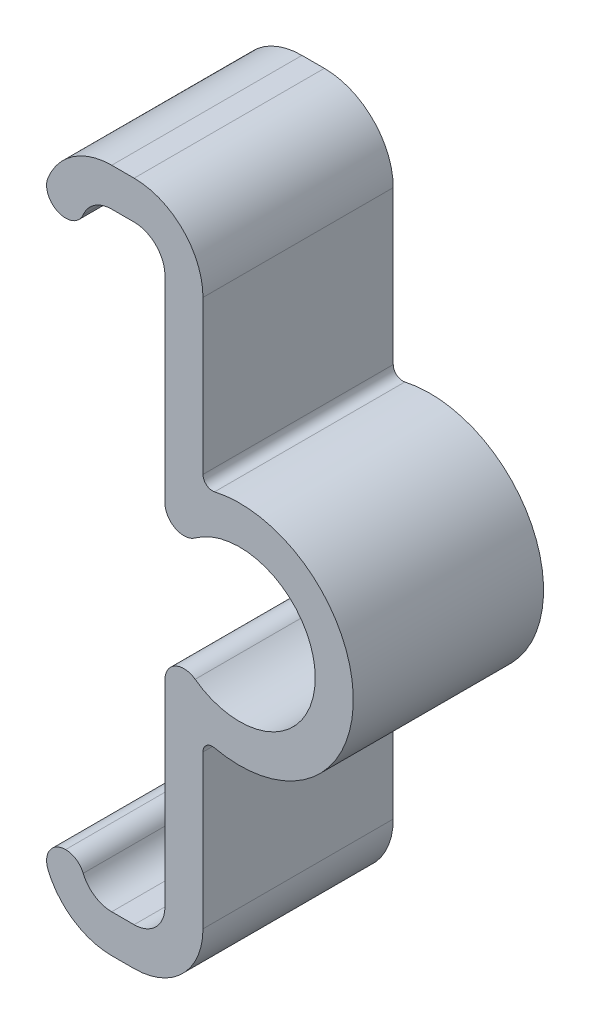
ISO-10303-21;
HEADER;
FILE_DESCRIPTION(('STEP AP214'),'2;1');
FILE_NAME('part.step','',(''),(''),'','','');
FILE_SCHEMA(('AUTOMOTIVE_DESIGN { 1 0 10303 214 1 1 1 1 }'));
ENDSEC;
DATA;
#1=APPLICATION_CONTEXT('core data for automotive mechanical design processes');
#2=APPLICATION_PROTOCOL_DEFINITION('international standard','automotive_design',2000,#1);
#3=PRODUCT_CONTEXT('',#1,'mechanical');
#4=PRODUCT('Part','Part','',(#3));
#5=PRODUCT_RELATED_PRODUCT_CATEGORY('part','',(#4));
#6=PRODUCT_DEFINITION_FORMATION('','',#4);
#7=PRODUCT_DEFINITION_CONTEXT('part definition',#1,'design');
#8=PRODUCT_DEFINITION('design','',#6,#7);
#9=PRODUCT_DEFINITION_SHAPE('','',#8);
#10=(LENGTH_UNIT() NAMED_UNIT(*) SI_UNIT(.MILLI.,.METRE.));
#11=(NAMED_UNIT(*) PLANE_ANGLE_UNIT() SI_UNIT($,.RADIAN.));
#12=(NAMED_UNIT(*) SI_UNIT($,.STERADIAN.) SOLID_ANGLE_UNIT());
#13=UNCERTAINTY_MEASURE_WITH_UNIT(LENGTH_MEASURE(1.E-05),#10,'distance_accuracy_value','');
#14=(GEOMETRIC_REPRESENTATION_CONTEXT(3) GLOBAL_UNCERTAINTY_ASSIGNED_CONTEXT((#13)) GLOBAL_UNIT_ASSIGNED_CONTEXT((#10,
#11,#12)) REPRESENTATION_CONTEXT('',''));
#15=CARTESIAN_POINT('',(0.,0.,0.));
#16=DIRECTION('',(0.,0.,1.));
#17=DIRECTION('',(1.,0.,0.));
#18=AXIS2_PLACEMENT_3D('',#15,#16,#17);
#19=CARTESIAN_POINT('',(0.,17.9899999999998,10.));
#20=DIRECTION('',(0.,-1.,0.));
#21=DIRECTION('',(1.,0.,0.));
#22=AXIS2_PLACEMENT_3D('',#19,#20,#21);
#23=PLANE('',#22);
#24=DIRECTION('',(-1.,0.,0.));
#25=VECTOR('',#24,1.);
#26=CARTESIAN_POINT('',(0.,17.9899999999998,0.));
#27=LINE('',#26,#25);
#28=CARTESIAN_POINT('',(-1.56999999999988,17.9899999999998,0.));
#29=VERTEX_POINT('',#28);
#30=CARTESIAN_POINT('',(-2.74800000000017,17.9899999999998,0.));
#31=VERTEX_POINT('',#30);
#32=EDGE_CURVE('E230',#29,#31,#27,.T.);
#33=ORIENTED_EDGE('',*,*,#32,.T.);
#34=DIRECTION('',(0.,0.,-1.));
#35=VECTOR('',#34,1.);
#36=CARTESIAN_POINT('',(-2.74800000000017,17.9899999999998,10.));
#37=LINE('',#36,#35);
#38=CARTESIAN_POINT('',(-2.74800000000017,17.9899999999998,10.));
#39=VERTEX_POINT('',#38);
#40=EDGE_CURVE('E213',#39,#31,#37,.T.);
#41=ORIENTED_EDGE('',*,*,#40,.F.);
#42=DIRECTION('',(-1.,0.,0.));
#43=VECTOR('',#42,1.);
#44=CARTESIAN_POINT('',(0.,17.9899999999998,10.));
#45=LINE('',#44,#43);
#46=CARTESIAN_POINT('',(-1.56999999999988,17.9899999999998,10.));
#47=VERTEX_POINT('',#46);
#48=EDGE_CURVE('E218',#47,#39,#45,.T.);
#49=ORIENTED_EDGE('',*,*,#48,.F.);
#50=DIRECTION('',(0.,0.,-1.));
#51=VECTOR('',#50,1.);
#52=CARTESIAN_POINT('',(-1.56999999999988,17.9899999999998,10.));
#53=LINE('',#52,#51);
#54=EDGE_CURVE('E342',#47,#29,#53,.T.);
#55=ORIENTED_EDGE('',*,*,#54,.T.);
#56=EDGE_LOOP('',(#33,#41,#49,#55));
#57=FACE_BOUND('',#56,.T.);
#58=ADVANCED_FACE('F35',(#57),#23,.F.);
#59=CARTESIAN_POINT('',(-2.74800000000055,14.37,10.));
#60=DIRECTION('',(0.,0.,-1.));
#61=DIRECTION('',(-1.,0.,0.));
#62=AXIS2_PLACEMENT_3D('',#59,#60,#61);
#63=CYLINDRICAL_SURFACE('',#62,3.61999999999977);
#64=CARTESIAN_POINT('',(-2.74800000000055,14.37,0.));
#65=DIRECTION('',(0.,0.,1.));
#66=DIRECTION('',(1.,0.,0.));
#67=AXIS2_PLACEMENT_3D('',#64,#65,#66);
#68=CIRCLE('',#67,3.61999999999977);
#69=CARTESIAN_POINT('',(-6.09394711033358,15.7516793893131,0.));
#70=VERTEX_POINT('',#69);
#71=EDGE_CURVE('E296',#31,#70,#68,.T.);
#72=ORIENTED_EDGE('',*,*,#71,.T.);
#73=DIRECTION('',(0.,0.,-1.));
#74=VECTOR('',#73,1.);
#75=CARTESIAN_POINT('',(-6.09394711033358,15.7516793893131,10.));
#76=LINE('',#75,#74);
#77=CARTESIAN_POINT('',(-6.09394711033358,15.7516793893131,10.));
#78=VERTEX_POINT('',#77);
#79=EDGE_CURVE('E216',#70,#78,#76,.F.);
#80=ORIENTED_EDGE('',*,*,#79,.T.);
#81=CARTESIAN_POINT('',(-2.74800000000055,14.37,10.));
#82=DIRECTION('',(0.,0.,1.));
#83=DIRECTION('',(1.,0.,0.));
#84=AXIS2_PLACEMENT_3D('',#81,#82,#83);
#85=CIRCLE('',#84,3.61999999999977);
#86=EDGE_CURVE('E208',#39,#78,#85,.T.);
#87=ORIENTED_EDGE('',*,*,#86,.F.);
#88=ORIENTED_EDGE('',*,*,#40,.T.);
#89=EDGE_LOOP('',(#72,#80,#87,#88));
#90=FACE_BOUND('',#89,.T.);
#91=ADVANCED_FACE('F211',(#90),#63,.T.);
#92=CARTESIAN_POINT('',(-2.74800000000056,14.37,10.));
#93=DIRECTION('',(0.,0.,-1.));
#94=DIRECTION('',(-1.,0.,0.));
#95=AXIS2_PLACEMENT_3D('',#92,#93,#94);
#96=CYLINDRICAL_SURFACE('',#95,1.61999999999978);
#97=CARTESIAN_POINT('',(-2.74800000000056,14.37,10.));
#98=DIRECTION('',(0.,0.,1.));
#99=DIRECTION('',(1.,0.,0.));
#100=AXIS2_PLACEMENT_3D('',#97,#98,#99);
#101=CIRCLE('',#100,1.61999999999978);
#102=CARTESIAN_POINT('',(-2.74800000000017,15.9899999999998,10.));
#103=VERTEX_POINT('',#102);
#104=CARTESIAN_POINT('',(-4.24535754661357,14.988320610687,10.));
#105=VERTEX_POINT('',#104);
#106=EDGE_CURVE('E217',#103,#105,#101,.T.);
#107=ORIENTED_EDGE('',*,*,#106,.T.);
#108=DIRECTION('',(0.,0.,-1.));
#109=VECTOR('',#108,1.);
#110=CARTESIAN_POINT('',(-4.24535754661357,14.988320610687,10.));
#111=LINE('',#110,#109);
#112=CARTESIAN_POINT('',(-4.24535754661357,14.988320610687,0.));
#113=VERTEX_POINT('',#112);
#114=EDGE_CURVE('E288',#105,#113,#111,.T.);
#115=ORIENTED_EDGE('',*,*,#114,.T.);
#116=CARTESIAN_POINT('',(-2.74800000000056,14.37,0.));
#117=DIRECTION('',(0.,0.,1.));
#118=DIRECTION('',(1.,0.,0.));
#119=AXIS2_PLACEMENT_3D('',#116,#117,#118);
#120=CIRCLE('',#119,1.61999999999978);
#121=CARTESIAN_POINT('',(-2.74800000000017,15.9899999999998,0.));
#122=VERTEX_POINT('',#121);
#123=EDGE_CURVE('E381',#122,#113,#120,.T.);
#124=ORIENTED_EDGE('',*,*,#123,.F.);
#125=DIRECTION('',(0.,0.,-1.));
#126=VECTOR('',#125,1.);
#127=CARTESIAN_POINT('',(-2.74800000000017,15.9899999999998,10.));
#128=LINE('',#127,#126);
#129=EDGE_CURVE('E232',#103,#122,#128,.T.);
#130=ORIENTED_EDGE('',*,*,#129,.F.);
#131=EDGE_LOOP('',(#107,#115,#124,#130));
#132=FACE_BOUND('',#131,.T.);
#133=ADVANCED_FACE('F518',(#132),#96,.F.);
#134=CARTESIAN_POINT('',(-6.59312728916929E-13,15.9899999999999,10.));
#135=DIRECTION('',(0.,-1.,0.));
#136=DIRECTION('',(1.,0.,0.));
#137=AXIS2_PLACEMENT_3D('',#134,#135,#136);
#138=PLANE('',#137);
#139=DIRECTION('',(-1.,0.,0.));
#140=VECTOR('',#139,1.);
#141=CARTESIAN_POINT('',(-6.59312728916929E-13,15.9899999999999,0.));
#142=LINE('',#141,#140);
#143=CARTESIAN_POINT('',(-1.56999999999988,15.9899999999999,0.));
#144=VERTEX_POINT('',#143);
#145=EDGE_CURVE('E377',#144,#122,#142,.T.);
#146=ORIENTED_EDGE('',*,*,#145,.F.);
#147=DIRECTION('',(0.,0.,-1.));
#148=VECTOR('',#147,1.);
#149=CARTESIAN_POINT('',(-1.56999999999988,15.9899999999999,10.));
#150=LINE('',#149,#148);
#151=CARTESIAN_POINT('',(-1.56999999999988,15.9899999999999,10.));
#152=VERTEX_POINT('',#151);
#153=EDGE_CURVE('E237',#152,#144,#150,.T.);
#154=ORIENTED_EDGE('',*,*,#153,.F.);
#155=DIRECTION('',(-1.,0.,0.));
#156=VECTOR('',#155,1.);
#157=CARTESIAN_POINT('',(-6.59312728916929E-13,15.9899999999999,10.));
#158=LINE('',#157,#156);
#159=EDGE_CURVE('E427',#152,#103,#158,.T.);
#160=ORIENTED_EDGE('',*,*,#159,.T.);
#161=ORIENTED_EDGE('',*,*,#129,.T.);
#162=EDGE_LOOP('',(#146,#154,#160,#161));
#163=FACE_BOUND('',#162,.T.);
#164=ADVANCED_FACE('F378',(#163),#138,.T.);
#165=CARTESIAN_POINT('',(-1.56999999999988,14.37,10.));
#166=DIRECTION('',(0.,0.,-1.));
#167=DIRECTION('',(-1.,0.,0.));
#168=AXIS2_PLACEMENT_3D('',#165,#166,#167);
#169=CYLINDRICAL_SURFACE('',#168,1.61999999999985);
#170=CARTESIAN_POINT('',(-1.56999999999988,14.37,0.));
#171=DIRECTION('',(0.,0.,1.));
#172=DIRECTION('',(1.,0.,0.));
#173=AXIS2_PLACEMENT_3D('',#170,#171,#172);
#174=CIRCLE('',#173,1.61999999999985);
#175=CARTESIAN_POINT('',(0.05,14.3700000000001,0.));
#176=VERTEX_POINT('',#175);
#177=EDGE_CURVE('E370',#176,#144,#174,.T.);
#178=ORIENTED_EDGE('',*,*,#177,.F.);
#179=DIRECTION('',(0.,0.,-1.));
#180=VECTOR('',#179,1.);
#181=CARTESIAN_POINT('',(0.05,14.3700000000001,10.));
#182=LINE('',#181,#180);
#183=CARTESIAN_POINT('',(0.05,14.3700000000001,10.));
#184=VERTEX_POINT('',#183);
#185=EDGE_CURVE('E361',#184,#176,#182,.T.);
#186=ORIENTED_EDGE('',*,*,#185,.F.);
#187=CARTESIAN_POINT('',(-1.56999999999988,14.37,10.));
#188=DIRECTION('',(0.,0.,1.));
#189=DIRECTION('',(1.,0.,0.));
#190=AXIS2_PLACEMENT_3D('',#187,#188,#189);
#191=CIRCLE('',#190,1.61999999999985);
#192=EDGE_CURVE('E372',#184,#152,#191,.T.);
#193=ORIENTED_EDGE('',*,*,#192,.T.);
#194=ORIENTED_EDGE('',*,*,#153,.T.);
#195=EDGE_LOOP('',(#178,#186,#193,#194));
#196=FACE_BOUND('',#195,.T.);
#197=ADVANCED_FACE('F367',(#196),#169,.F.);
#198=CARTESIAN_POINT('',(0.0499999999999965,0.,10.));
#199=DIRECTION('',(-1.,0.,0.));
#200=DIRECTION('',(0.,-1.,0.));
#201=AXIS2_PLACEMENT_3D('',#198,#199,#200);
#202=PLANE('',#201);
#203=DIRECTION('',(0.,1.,0.));
#204=VECTOR('',#203,1.);
#205=CARTESIAN_POINT('',(0.0499999999999965,0.,0.));
#206=LINE('',#205,#204);
#207=CARTESIAN_POINT('',(0.0499999999999975,4.02430118157177,0.));
#208=VERTEX_POINT('',#207);
#209=EDGE_CURVE('E384',#208,#176,#206,.T.);
#210=ORIENTED_EDGE('',*,*,#209,.F.);
#211=DIRECTION('',(0.,0.,-1.));
#212=VECTOR('',#211,1.);
#213=CARTESIAN_POINT('',(0.0499999999999975,4.02430118157177,10.));
#214=LINE('',#213,#212);
#215=CARTESIAN_POINT('',(0.0499999999999975,4.02430118157177,10.));
#216=VERTEX_POINT('',#215);
#217=EDGE_CURVE('E253',#208,#216,#214,.F.);
#218=ORIENTED_EDGE('',*,*,#217,.T.);
#219=DIRECTION('',(0.,1.,0.));
#220=VECTOR('',#219,1.);
#221=CARTESIAN_POINT('',(0.0499999999999965,0.,10.));
#222=LINE('',#221,#220);
#223=EDGE_CURVE('E426',#216,#184,#222,.T.);
#224=ORIENTED_EDGE('',*,*,#223,.T.);
#225=ORIENTED_EDGE('',*,*,#185,.T.);
#226=EDGE_LOOP('',(#210,#218,#224,#225));
#227=FACE_BOUND('',#226,.T.);
#228=ADVANCED_FACE('F424',(#227),#202,.T.);
#229=CARTESIAN_POINT('',(3.975,0.,10.));
#230=DIRECTION('',(0.,0.,-1.));
#231=DIRECTION('',(-1.,0.,0.));
#232=AXIS2_PLACEMENT_3D('',#229,#230,#231);
#233=CYLINDRICAL_SURFACE('',#232,3.975);
#234=CARTESIAN_POINT('',(3.975,0.,0.));
#235=DIRECTION('',(0.,0.,1.));
#236=DIRECTION('',(1.,0.,0.));
#237=AXIS2_PLACEMENT_3D('',#234,#235,#236);
#238=CIRCLE('',#237,3.975);
#239=CARTESIAN_POINT('',(1.63793969849246,-3.21539642145684,0.));
#240=VERTEX_POINT('',#239);
#241=CARTESIAN_POINT('',(1.63793969849246,3.21539642145685,0.));
#242=VERTEX_POINT('',#241);
#243=EDGE_CURVE('E386',#240,#242,#238,.T.);
#244=ORIENTED_EDGE('',*,*,#243,.F.);
#245=DIRECTION('',(0.,0.,-1.));
#246=VECTOR('',#245,1.);
#247=CARTESIAN_POINT('',(1.63793969849246,-3.21539642145684,10.));
#248=LINE('',#247,#246);
#249=CARTESIAN_POINT('',(1.63793969849246,-3.21539642145684,10.));
#250=VERTEX_POINT('',#249);
#251=EDGE_CURVE('E247',#240,#250,#248,.F.);
#252=ORIENTED_EDGE('',*,*,#251,.T.);
#253=CARTESIAN_POINT('',(3.975,0.,10.));
#254=DIRECTION('',(0.,0.,1.));
#255=DIRECTION('',(1.,0.,0.));
#256=AXIS2_PLACEMENT_3D('',#253,#254,#255);
#257=CIRCLE('',#256,3.975);
#258=CARTESIAN_POINT('',(1.63793969849246,3.21539642145685,10.));
#259=VERTEX_POINT('',#258);
#260=EDGE_CURVE('E418',#250,#259,#257,.T.);
#261=ORIENTED_EDGE('',*,*,#260,.T.);
#262=DIRECTION('',(0.,0.,-1.));
#263=VECTOR('',#262,1.);
#264=CARTESIAN_POINT('',(1.63793969849246,3.21539642145685,10.));
#265=LINE('',#264,#263);
#266=EDGE_CURVE('E244',#259,#242,#265,.T.);
#267=ORIENTED_EDGE('',*,*,#266,.T.);
#268=EDGE_LOOP('',(#244,#252,#261,#267));
#269=FACE_BOUND('',#268,.T.);
#270=ADVANCED_FACE('F414',(#269),#233,.F.);
#271=CARTESIAN_POINT('',(0.0499999999999965,0.,10.));
#272=DIRECTION('',(-1.,0.,0.));
#273=DIRECTION('',(0.,-1.,0.));
#274=AXIS2_PLACEMENT_3D('',#271,#272,#273);
#275=PLANE('',#274);
#276=DIRECTION('',(0.,1.,0.));
#277=VECTOR('',#276,1.);
#278=CARTESIAN_POINT('',(0.0499999999999965,0.,10.));
#279=LINE('',#278,#277);
#280=CARTESIAN_POINT('',(0.049999999999993,-14.3700000000001,10.));
#281=VERTEX_POINT('',#280);
#282=CARTESIAN_POINT('',(0.0499999999999955,-4.02430118157177,10.));
#283=VERTEX_POINT('',#282);
#284=EDGE_CURVE('E407',#281,#283,#279,.T.);
#285=ORIENTED_EDGE('',*,*,#284,.T.);
#286=DIRECTION('',(0.,0.,-1.));
#287=VECTOR('',#286,1.);
#288=CARTESIAN_POINT('',(0.0499999999999955,-4.02430118157177,10.));
#289=LINE('',#288,#287);
#290=CARTESIAN_POINT('',(0.0499999999999955,-4.02430118157177,0.));
#291=VERTEX_POINT('',#290);
#292=EDGE_CURVE('E231',#283,#291,#289,.T.);
#293=ORIENTED_EDGE('',*,*,#292,.T.);
#294=DIRECTION('',(0.,1.,0.));
#295=VECTOR('',#294,1.);
#296=CARTESIAN_POINT('',(0.0499999999999965,0.,0.));
#297=LINE('',#296,#295);
#298=CARTESIAN_POINT('',(0.049999999999993,-14.3700000000001,0.));
#299=VERTEX_POINT('',#298);
#300=EDGE_CURVE('E392',#299,#291,#297,.T.);
#301=ORIENTED_EDGE('',*,*,#300,.F.);
#302=DIRECTION('',(0.,0.,-1.));
#303=VECTOR('',#302,1.);
#304=CARTESIAN_POINT('',(0.049999999999993,-14.3700000000001,10.));
#305=LINE('',#304,#303);
#306=EDGE_CURVE('E359',#281,#299,#305,.T.);
#307=ORIENTED_EDGE('',*,*,#306,.F.);
#308=EDGE_LOOP('',(#285,#293,#301,#307));
#309=FACE_BOUND('',#308,.T.);
#310=ADVANCED_FACE('F405',(#309),#275,.T.);
#311=CARTESIAN_POINT('',(-1.57000000000018,-14.3700000000001,10.));
#312=DIRECTION('',(0.,0.,-1.));
#313=DIRECTION('',(-1.,0.,0.));
#314=AXIS2_PLACEMENT_3D('',#311,#312,#313);
#315=CYLINDRICAL_SURFACE('',#314,1.62000000000017);
#316=CARTESIAN_POINT('',(-1.57000000000018,-14.3700000000001,0.));
#317=DIRECTION('',(0.,0.,1.));
#318=DIRECTION('',(1.,0.,0.));
#319=AXIS2_PLACEMENT_3D('',#316,#317,#318);
#320=CIRCLE('',#319,1.62000000000017);
#321=CARTESIAN_POINT('',(-1.57000000000015,-15.9900000000003,0.));
#322=VERTEX_POINT('',#321);
#323=EDGE_CURVE('E326',#322,#299,#320,.T.);
#324=ORIENTED_EDGE('',*,*,#323,.F.);
#325=DIRECTION('',(0.,0.,-1.));
#326=VECTOR('',#325,1.);
#327=CARTESIAN_POINT('',(-1.57000000000015,-15.9900000000003,10.));
#328=LINE('',#327,#326);
#329=CARTESIAN_POINT('',(-1.57000000000015,-15.9900000000003,10.));
#330=VERTEX_POINT('',#329);
#331=EDGE_CURVE('E357',#330,#322,#328,.T.);
#332=ORIENTED_EDGE('',*,*,#331,.F.);
#333=CARTESIAN_POINT('',(-1.57000000000018,-14.3700000000001,10.));
#334=DIRECTION('',(0.,0.,1.));
#335=DIRECTION('',(1.,0.,0.));
#336=AXIS2_PLACEMENT_3D('',#333,#334,#335);
#337=CIRCLE('',#336,1.62000000000017);
#338=EDGE_CURVE('E401',#330,#281,#337,.T.);
#339=ORIENTED_EDGE('',*,*,#338,.T.);
#340=ORIENTED_EDGE('',*,*,#306,.T.);
#341=EDGE_LOOP('',(#324,#332,#339,#340));
#342=FACE_BOUND('',#341,.T.);
#343=ADVANCED_FACE('F398',(#342),#315,.F.);
#344=CARTESIAN_POINT('',(0.,-15.9900000000003,10.));
#345=DIRECTION('',(0.,1.,0.));
#346=DIRECTION('',(0.,0.,1.));
#347=AXIS2_PLACEMENT_3D('',#344,#345,#346);
#348=PLANE('',#347);
#349=DIRECTION('',(1.,0.,0.));
#350=VECTOR('',#349,1.);
#351=CARTESIAN_POINT('',(0.,-15.9900000000003,0.));
#352=LINE('',#351,#350);
#353=CARTESIAN_POINT('',(-2.74799999999983,-15.9900000000003,0.));
#354=VERTEX_POINT('',#353);
#355=EDGE_CURVE('E322',#354,#322,#352,.T.);
#356=ORIENTED_EDGE('',*,*,#355,.F.);
#357=DIRECTION('',(0.,0.,-1.));
#358=VECTOR('',#357,1.);
#359=CARTESIAN_POINT('',(-2.74799999999983,-15.9900000000003,10.));
#360=LINE('',#359,#358);
#361=CARTESIAN_POINT('',(-2.74799999999983,-15.9900000000003,10.));
#362=VERTEX_POINT('',#361);
#363=EDGE_CURVE('E319',#362,#354,#360,.T.);
#364=ORIENTED_EDGE('',*,*,#363,.F.);
#365=DIRECTION('',(1.,0.,0.));
#366=VECTOR('',#365,1.);
#367=CARTESIAN_POINT('',(0.,-15.9900000000003,10.));
#368=LINE('',#367,#366);
#369=EDGE_CURVE('E436',#362,#330,#368,.T.);
#370=ORIENTED_EDGE('',*,*,#369,.T.);
#371=ORIENTED_EDGE('',*,*,#331,.T.);
#372=EDGE_LOOP('',(#356,#364,#370,#371));
#373=FACE_BOUND('',#372,.T.);
#374=ADVANCED_FACE('F504',(#373),#348,.T.);
#375=CARTESIAN_POINT('',(-2.74799999999983,-14.3700000000001,10.));
#376=DIRECTION('',(0.,0.,-1.));
#377=DIRECTION('',(-1.,0.,0.));
#378=AXIS2_PLACEMENT_3D('',#375,#376,#377);
#379=CYLINDRICAL_SURFACE('',#378,1.62000000000016);
#380=CARTESIAN_POINT('',(-2.74799999999983,-14.3700000000001,0.));
#381=DIRECTION('',(0.,0.,1.));
#382=DIRECTION('',(1.,0.,0.));
#383=AXIS2_PLACEMENT_3D('',#380,#381,#382);
#384=CIRCLE('',#383,1.62000000000016);
#385=CARTESIAN_POINT('',(-4.24535754661323,-14.9883206106872,0.));
#386=VERTEX_POINT('',#385);
#387=EDGE_CURVE('E312',#386,#354,#384,.T.);
#388=ORIENTED_EDGE('',*,*,#387,.F.);
#389=DIRECTION('',(0.,0.,-1.));
#390=VECTOR('',#389,1.);
#391=CARTESIAN_POINT('',(-4.24535754661323,-14.9883206106872,10.));
#392=LINE('',#391,#390);
#393=CARTESIAN_POINT('',(-4.24535754661323,-14.9883206106872,10.));
#394=VERTEX_POINT('',#393);
#395=EDGE_CURVE('E11',#386,#394,#392,.F.);
#396=ORIENTED_EDGE('',*,*,#395,.T.);
#397=CARTESIAN_POINT('',(-2.74799999999983,-14.3700000000001,10.));
#398=DIRECTION('',(0.,0.,1.));
#399=DIRECTION('',(1.,0.,0.));
#400=AXIS2_PLACEMENT_3D('',#397,#398,#399);
#401=CIRCLE('',#400,1.62000000000016);
#402=EDGE_CURVE('E439',#394,#362,#401,.T.);
#403=ORIENTED_EDGE('',*,*,#402,.T.);
#404=ORIENTED_EDGE('',*,*,#363,.T.);
#405=EDGE_LOOP('',(#388,#396,#403,#404));
#406=FACE_BOUND('',#405,.T.);
#407=ADVANCED_FACE('F316',(#406),#379,.F.);
#408=CARTESIAN_POINT('',(-2.74799999999983,-14.3700000000001,10.));
#409=DIRECTION('',(0.,0.,-1.));
#410=DIRECTION('',(-1.,0.,0.));
#411=AXIS2_PLACEMENT_3D('',#408,#409,#410);
#412=CYLINDRICAL_SURFACE('',#411,3.62000000000015);
#413=CARTESIAN_POINT('',(-2.74799999999983,-14.3700000000001,10.));
#414=DIRECTION('',(0.,0.,1.));
#415=DIRECTION('',(1.,0.,0.));
#416=AXIS2_PLACEMENT_3D('',#413,#414,#415);
#417=CIRCLE('',#416,3.62000000000015);
#418=CARTESIAN_POINT('',(-6.0939471103333,-15.7516793893131,10.));
#419=VERTEX_POINT('',#418);
#420=CARTESIAN_POINT('',(-2.74799999999983,-17.9900000000003,10.));
#421=VERTEX_POINT('',#420);
#422=EDGE_CURVE('E441',#419,#421,#417,.T.);
#423=ORIENTED_EDGE('',*,*,#422,.F.);
#424=DIRECTION('',(0.,0.,-1.));
#425=VECTOR('',#424,1.);
#426=CARTESIAN_POINT('',(-6.0939471103333,-15.7516793893131,10.));
#427=LINE('',#426,#425);
#428=CARTESIAN_POINT('',(-6.0939471103333,-15.7516793893131,0.));
#429=VERTEX_POINT('',#428);
#430=EDGE_CURVE('E44',#419,#429,#427,.T.);
#431=ORIENTED_EDGE('',*,*,#430,.T.);
#432=CARTESIAN_POINT('',(-2.74799999999983,-14.3700000000001,0.));
#433=DIRECTION('',(0.,0.,1.));
#434=DIRECTION('',(1.,0.,0.));
#435=AXIS2_PLACEMENT_3D('',#432,#433,#434);
#436=CIRCLE('',#435,3.62000000000015);
#437=CARTESIAN_POINT('',(-2.74799999999983,-17.9900000000003,0.));
#438=VERTEX_POINT('',#437);
#439=EDGE_CURVE('E321',#429,#438,#436,.T.);
#440=ORIENTED_EDGE('',*,*,#439,.T.);
#441=DIRECTION('',(0.,0.,-1.));
#442=VECTOR('',#441,1.);
#443=CARTESIAN_POINT('',(-2.74799999999983,-17.9900000000003,10.));
#444=LINE('',#443,#442);
#445=EDGE_CURVE('E353',#421,#438,#444,.T.);
#446=ORIENTED_EDGE('',*,*,#445,.F.);
#447=EDGE_LOOP('',(#423,#431,#440,#446));
#448=FACE_BOUND('',#447,.T.);
#449=ADVANCED_FACE('F501',(#448),#412,.T.);
#450=CARTESIAN_POINT('',(0.,-17.9900000000003,10.));
#451=DIRECTION('',(0.,1.,0.));
#452=DIRECTION('',(0.,0.,1.));
#453=AXIS2_PLACEMENT_3D('',#450,#451,#452);
#454=PLANE('',#453);
#455=DIRECTION('',(1.,0.,0.));
#456=VECTOR('',#455,1.);
#457=CARTESIAN_POINT('',(0.,-17.9900000000003,0.));
#458=LINE('',#457,#456);
#459=CARTESIAN_POINT('',(-1.57000000000015,-17.9900000000003,0.));
#460=VERTEX_POINT('',#459);
#461=EDGE_CURVE('E324',#438,#460,#458,.T.);
#462=ORIENTED_EDGE('',*,*,#461,.T.);
#463=DIRECTION('',(0.,0.,-1.));
#464=VECTOR('',#463,1.);
#465=CARTESIAN_POINT('',(-1.57000000000015,-17.9900000000003,10.));
#466=LINE('',#465,#464);
#467=CARTESIAN_POINT('',(-1.57000000000015,-17.9900000000003,10.));
#468=VERTEX_POINT('',#467);
#469=EDGE_CURVE('E350',#468,#460,#466,.T.);
#470=ORIENTED_EDGE('',*,*,#469,.F.);
#471=DIRECTION('',(1.,0.,0.));
#472=VECTOR('',#471,1.);
#473=CARTESIAN_POINT('',(0.,-17.9900000000003,10.));
#474=LINE('',#473,#472);
#475=EDGE_CURVE('E443',#421,#468,#474,.T.);
#476=ORIENTED_EDGE('',*,*,#475,.F.);
#477=ORIENTED_EDGE('',*,*,#445,.T.);
#478=EDGE_LOOP('',(#462,#470,#476,#477));
#479=FACE_BOUND('',#478,.T.);
#480=ADVANCED_FACE('F496',(#479),#454,.F.);
#481=CARTESIAN_POINT('',(-1.57000000000018,-14.3700000000001,10.));
#482=DIRECTION('',(0.,0.,-1.));
#483=DIRECTION('',(-1.,0.,0.));
#484=AXIS2_PLACEMENT_3D('',#481,#482,#483);
#485=CYLINDRICAL_SURFACE('',#484,3.62000000000017);
#486=CARTESIAN_POINT('',(-1.57000000000018,-14.3700000000001,0.));
#487=DIRECTION('',(0.,0.,1.));
#488=DIRECTION('',(1.,0.,0.));
#489=AXIS2_PLACEMENT_3D('',#486,#487,#488);
#490=CIRCLE('',#489,3.62000000000017);
#491=CARTESIAN_POINT('',(2.04999999999999,-14.3700000000001,0.));
#492=VERTEX_POINT('',#491);
#493=EDGE_CURVE('E331',#460,#492,#490,.T.);
#494=ORIENTED_EDGE('',*,*,#493,.T.);
#495=DIRECTION('',(0.,0.,-1.));
#496=VECTOR('',#495,1.);
#497=CARTESIAN_POINT('',(2.04999999999999,-14.3700000000001,10.));
#498=LINE('',#497,#496);
#499=CARTESIAN_POINT('',(2.04999999999999,-14.3700000000001,10.));
#500=VERTEX_POINT('',#499);
#501=EDGE_CURVE('E347',#500,#492,#498,.T.);
#502=ORIENTED_EDGE('',*,*,#501,.F.);
#503=CARTESIAN_POINT('',(-1.57000000000018,-14.3700000000001,10.));
#504=DIRECTION('',(0.,0.,1.));
#505=DIRECTION('',(1.,0.,0.));
#506=AXIS2_PLACEMENT_3D('',#503,#504,#505);
#507=CIRCLE('',#506,3.62000000000017);
#508=EDGE_CURVE('E445',#468,#500,#507,.T.);
#509=ORIENTED_EDGE('',*,*,#508,.F.);
#510=ORIENTED_EDGE('',*,*,#469,.T.);
#511=EDGE_LOOP('',(#494,#502,#509,#510));
#512=FACE_BOUND('',#511,.T.);
#513=ADVANCED_FACE('F492',(#512),#485,.T.);
#514=CARTESIAN_POINT('',(2.04999999999997,0.,10.));
#515=DIRECTION('',(-1.,0.,0.));
#516=DIRECTION('',(0.,-1.,0.));
#517=AXIS2_PLACEMENT_3D('',#514,#515,#516);
#518=PLANE('',#517);
#519=DIRECTION('',(0.,1.,0.));
#520=VECTOR('',#519,1.);
#521=CARTESIAN_POINT('',(2.04999999999997,0.,0.));
#522=LINE('',#521,#520);
#523=CARTESIAN_POINT('',(2.04999999999998,-6.31624888679982,0.));
#524=VERTEX_POINT('',#523);
#525=EDGE_CURVE('E333',#492,#524,#522,.T.);
#526=ORIENTED_EDGE('',*,*,#525,.T.);
#527=DIRECTION('',(0.,0.,1.));
#528=VECTOR('',#527,1.);
#529=CARTESIAN_POINT('',(2.04999999999998,-6.31624888679982,10.));
#530=LINE('',#529,#528);
#531=CARTESIAN_POINT('',(2.04999999999998,-6.31624888679982,10.));
#532=VERTEX_POINT('',#531);
#533=EDGE_CURVE('E260',#524,#532,#530,.T.);
#534=ORIENTED_EDGE('',*,*,#533,.T.);
#535=DIRECTION('',(0.,1.,0.));
#536=VECTOR('',#535,1.);
#537=CARTESIAN_POINT('',(2.04999999999997,0.,10.));
#538=LINE('',#537,#536);
#539=EDGE_CURVE('E447',#500,#532,#538,.T.);
#540=ORIENTED_EDGE('',*,*,#539,.F.);
#541=ORIENTED_EDGE('',*,*,#501,.T.);
#542=EDGE_LOOP('',(#526,#534,#540,#541));
#543=FACE_BOUND('',#542,.T.);
#544=ADVANCED_FACE('F487',(#543),#518,.F.);
#545=CARTESIAN_POINT('',(3.975,0.,10.));
#546=DIRECTION('',(0.,0.,-1.));
#547=DIRECTION('',(-1.,0.,0.));
#548=AXIS2_PLACEMENT_3D('',#545,#546,#547);
#549=CYLINDRICAL_SURFACE('',#548,5.975);
#550=CARTESIAN_POINT('',(3.975,0.,10.));
#551=DIRECTION('',(0.,0.,1.));
#552=DIRECTION('',(1.,0.,0.));
#553=AXIS2_PLACEMENT_3D('',#550,#551,#552);
#554=CIRCLE('',#553,5.975);
#555=CARTESIAN_POINT('',(2.66003861003859,-5.82850766001991,10.));
#556=VERTEX_POINT('',#555);
#557=CARTESIAN_POINT('',(2.66003861003858,5.82850766001991,10.));
#558=VERTEX_POINT('',#557);
#559=EDGE_CURVE('E450',#556,#558,#554,.T.);
#560=ORIENTED_EDGE('',*,*,#559,.F.);
#561=DIRECTION('',(0.,0.,-1.));
#562=VECTOR('',#561,1.);
#563=CARTESIAN_POINT('',(2.66003861003859,-5.82850766001991,10.));
#564=LINE('',#563,#562);
#565=CARTESIAN_POINT('',(2.66003861003859,-5.82850766001991,0.));
#566=VERTEX_POINT('',#565);
#567=EDGE_CURVE('E257',#556,#566,#564,.T.);
#568=ORIENTED_EDGE('',*,*,#567,.T.);
#569=CARTESIAN_POINT('',(3.975,0.,0.));
#570=DIRECTION('',(0.,0.,1.));
#571=DIRECTION('',(1.,0.,0.));
#572=AXIS2_PLACEMENT_3D('',#569,#570,#571);
#573=CIRCLE('',#572,5.975);
#574=CARTESIAN_POINT('',(2.66003861003858,5.82850766001991,0.));
#575=VERTEX_POINT('',#574);
#576=EDGE_CURVE('E336',#566,#575,#573,.T.);
#577=ORIENTED_EDGE('',*,*,#576,.T.);
#578=DIRECTION('',(0.,0.,-1.));
#579=VECTOR('',#578,1.);
#580=CARTESIAN_POINT('',(2.66003861003858,5.82850766001991,10.));
#581=LINE('',#580,#579);
#582=EDGE_CURVE('E255',#575,#558,#581,.F.);
#583=ORIENTED_EDGE('',*,*,#582,.T.);
#584=EDGE_LOOP('',(#560,#568,#577,#583));
#585=FACE_BOUND('',#584,.T.);
#586=ADVANCED_FACE('F478',(#585),#549,.T.);
#587=CARTESIAN_POINT('',(2.04999999999997,0.,10.));
#588=DIRECTION('',(-1.,0.,0.));
#589=DIRECTION('',(0.,-1.,0.));
#590=AXIS2_PLACEMENT_3D('',#587,#588,#589);
#591=PLANE('',#590);
#592=DIRECTION('',(0.,1.,0.));
#593=VECTOR('',#592,1.);
#594=CARTESIAN_POINT('',(2.04999999999997,0.,10.));
#595=LINE('',#594,#593);
#596=CARTESIAN_POINT('',(2.04999999999996,6.31624888679981,10.));
#597=VERTEX_POINT('',#596);
#598=CARTESIAN_POINT('',(2.04999999999995,14.3700000000001,10.));
#599=VERTEX_POINT('',#598);
#600=EDGE_CURVE('E453',#597,#599,#595,.T.);
#601=ORIENTED_EDGE('',*,*,#600,.F.);
#602=DIRECTION('',(0.,0.,1.));
#603=VECTOR('',#602,1.);
#604=CARTESIAN_POINT('',(2.04999999999996,6.31624888679981,0.));
#605=LINE('',#604,#603);
#606=CARTESIAN_POINT('',(2.04999999999996,6.31624888679981,0.));
#607=VERTEX_POINT('',#606);
#608=EDGE_CURVE('E262',#597,#607,#605,.F.);
#609=ORIENTED_EDGE('',*,*,#608,.T.);
#610=DIRECTION('',(0.,1.,0.));
#611=VECTOR('',#610,1.);
#612=CARTESIAN_POINT('',(2.04999999999997,0.,0.));
#613=LINE('',#612,#611);
#614=CARTESIAN_POINT('',(2.04999999999995,14.3700000000001,0.));
#615=VERTEX_POINT('',#614);
#616=EDGE_CURVE('E339',#607,#615,#613,.T.);
#617=ORIENTED_EDGE('',*,*,#616,.T.);
#618=DIRECTION('',(0.,0.,-1.));
#619=VECTOR('',#618,1.);
#620=CARTESIAN_POINT('',(2.04999999999995,14.3700000000001,10.));
#621=LINE('',#620,#619);
#622=EDGE_CURVE('E344',#599,#615,#621,.T.);
#623=ORIENTED_EDGE('',*,*,#622,.F.);
#624=EDGE_LOOP('',(#601,#609,#617,#623));
#625=FACE_BOUND('',#624,.T.);
#626=ADVANCED_FACE('F469',(#625),#591,.F.);
#627=CARTESIAN_POINT('',(-1.56999999999988,14.37,10.));
#628=DIRECTION('',(0.,0.,-1.));
#629=DIRECTION('',(-1.,0.,0.));
#630=AXIS2_PLACEMENT_3D('',#627,#628,#629);
#631=CYLINDRICAL_SURFACE('',#630,3.61999999999983);
#632=CARTESIAN_POINT('',(-1.56999999999988,14.37,0.));
#633=DIRECTION('',(0.,0.,1.));
#634=DIRECTION('',(1.,0.,0.));
#635=AXIS2_PLACEMENT_3D('',#632,#633,#634);
#636=CIRCLE('',#635,3.61999999999983);
#637=EDGE_CURVE('E227',#615,#29,#636,.T.);
#638=ORIENTED_EDGE('',*,*,#637,.T.);
#639=ORIENTED_EDGE('',*,*,#54,.F.);
#640=CARTESIAN_POINT('',(-1.56999999999988,14.37,10.));
#641=DIRECTION('',(0.,0.,1.));
#642=DIRECTION('',(1.,0.,0.));
#643=AXIS2_PLACEMENT_3D('',#640,#641,#642);
#644=CIRCLE('',#643,3.61999999999983);
#645=EDGE_CURVE('E223',#599,#47,#644,.T.);
#646=ORIENTED_EDGE('',*,*,#645,.F.);
#647=ORIENTED_EDGE('',*,*,#622,.T.);
#648=EDGE_LOOP('',(#638,#639,#646,#647));
#649=FACE_BOUND('',#648,.T.);
#650=ADVANCED_FACE('F465',(#649),#631,.T.);
#651=CARTESIAN_POINT('',(0.,0.,10.));
#652=DIRECTION('',(0.,0.,1.));
#653=DIRECTION('',(1.,0.,0.));
#654=AXIS2_PLACEMENT_3D('',#651,#652,#653);
#655=PLANE('',#654);
#656=ORIENTED_EDGE('',*,*,#86,.T.);
#657=CARTESIAN_POINT('',(-5.16965232847357,15.37,10.));
#658=DIRECTION('',(0.,0.,1.));
#659=DIRECTION('',(1.,0.,0.));
#660=AXIS2_PLACEMENT_3D('',#657,#658,#659);
#661=CIRCLE('',#660,1.);
#662=CARTESIAN_POINT('',(-5.16965232847358,14.37,10.));
#663=VERTEX_POINT('',#662);
#664=EDGE_CURVE('E57',#78,#663,#661,.T.);
#665=ORIENTED_EDGE('',*,*,#664,.T.);
#666=CARTESIAN_POINT('',(-5.16965232847358,15.37,10.));
#667=DIRECTION('',(0.,0.,1.));
#668=DIRECTION('',(1.,0.,0.));
#669=AXIS2_PLACEMENT_3D('',#666,#667,#668);
#670=CIRCLE('',#669,1.);
#671=EDGE_CURVE('E52',#663,#105,#670,.T.);
#672=ORIENTED_EDGE('',*,*,#671,.T.);
#673=ORIENTED_EDGE('',*,*,#106,.F.);
#674=ORIENTED_EDGE('',*,*,#159,.F.);
#675=ORIENTED_EDGE('',*,*,#192,.F.);
#676=ORIENTED_EDGE('',*,*,#223,.F.);
#677=CARTESIAN_POINT('',(1.05,4.02430118157177,10.));
#678=DIRECTION('',(0.,0.,1.));
#679=DIRECTION('',(1.,0.,0.));
#680=AXIS2_PLACEMENT_3D('',#677,#678,#679);
#681=CIRCLE('',#680,1.);
#682=EDGE_CURVE('E249',#216,#259,#681,.T.);
#683=ORIENTED_EDGE('',*,*,#682,.T.);
#684=ORIENTED_EDGE('',*,*,#260,.F.);
#685=CARTESIAN_POINT('',(1.05,-4.02430118157177,10.));
#686=DIRECTION('',(0.,0.,1.));
#687=DIRECTION('',(1.,0.,0.));
#688=AXIS2_PLACEMENT_3D('',#685,#686,#687);
#689=CIRCLE('',#688,1.);
#690=EDGE_CURVE('E251',#250,#283,#689,.T.);
#691=ORIENTED_EDGE('',*,*,#690,.T.);
#692=ORIENTED_EDGE('',*,*,#284,.F.);
#693=ORIENTED_EDGE('',*,*,#338,.F.);
#694=ORIENTED_EDGE('',*,*,#369,.F.);
#695=ORIENTED_EDGE('',*,*,#402,.F.);
#696=CARTESIAN_POINT('',(-5.16965232847327,-15.3700000000001,10.));
#697=DIRECTION('',(0.,0.,1.));
#698=DIRECTION('',(1.,0.,0.));
#699=AXIS2_PLACEMENT_3D('',#696,#697,#698);
#700=CIRCLE('',#699,1.);
#701=CARTESIAN_POINT('',(-5.16965232847327,-14.3700000000001,10.));
#702=VERTEX_POINT('',#701);
#703=EDGE_CURVE('E282',#394,#702,#700,.T.);
#704=ORIENTED_EDGE('',*,*,#703,.T.);
#705=CARTESIAN_POINT('',(-5.16965232847327,-15.3700000000001,10.));
#706=DIRECTION('',(0.,0.,1.));
#707=DIRECTION('',(1.,0.,0.));
#708=AXIS2_PLACEMENT_3D('',#705,#706,#707);
#709=CIRCLE('',#708,1.);
#710=EDGE_CURVE('E284',#702,#419,#709,.T.);
#711=ORIENTED_EDGE('',*,*,#710,.T.);
#712=ORIENTED_EDGE('',*,*,#422,.T.);
#713=ORIENTED_EDGE('',*,*,#475,.T.);
#714=ORIENTED_EDGE('',*,*,#508,.T.);
#715=ORIENTED_EDGE('',*,*,#539,.T.);
#716=CARTESIAN_POINT('',(2.54999999999998,-6.31624888679982,10.));
#717=DIRECTION('',(0.,0.,1.));
#718=DIRECTION('',(1.,0.,0.));
#719=AXIS2_PLACEMENT_3D('',#716,#717,#718);
#720=CIRCLE('',#719,0.5);
#721=EDGE_CURVE('E267',#532,#556,#720,.F.);
#722=ORIENTED_EDGE('',*,*,#721,.T.);
#723=ORIENTED_EDGE('',*,*,#559,.T.);
#724=CARTESIAN_POINT('',(2.54999999999996,6.31624888679981,10.));
#725=DIRECTION('',(0.,0.,1.));
#726=DIRECTION('',(1.,0.,0.));
#727=AXIS2_PLACEMENT_3D('',#724,#725,#726);
#728=CIRCLE('',#727,0.5);
#729=EDGE_CURVE('E271',#558,#597,#728,.F.);
#730=ORIENTED_EDGE('',*,*,#729,.T.);
#731=ORIENTED_EDGE('',*,*,#600,.T.);
#732=ORIENTED_EDGE('',*,*,#645,.T.);
#733=ORIENTED_EDGE('',*,*,#48,.T.);
#734=EDGE_LOOP('',(#656,#665,#672,#673,#674,#675,#676,#683,#684,#691,#692,#693,#694,#695,#704,
#711,#712,#713,#714,#715,#722,#723,#730,#731,#732,#733));
#735=FACE_BOUND('',#734,.T.);
#736=ADVANCED_FACE('F221',(#735),#655,.T.);
#737=CARTESIAN_POINT('',(0.,0.,0.));
#738=DIRECTION('',(0.,0.,1.));
#739=DIRECTION('',(1.,0.,0.));
#740=AXIS2_PLACEMENT_3D('',#737,#738,#739);
#741=PLANE('',#740);
#742=CARTESIAN_POINT('',(-5.16965232847358,15.37,0.));
#743=DIRECTION('',(0.,0.,1.));
#744=DIRECTION('',(1.,0.,0.));
#745=AXIS2_PLACEMENT_3D('',#742,#743,#744);
#746=CIRCLE('',#745,1.);
#747=CARTESIAN_POINT('',(-5.16965232847358,14.37,0.));
#748=VERTEX_POINT('',#747);
#749=EDGE_CURVE('E277',#113,#748,#746,.F.);
#750=ORIENTED_EDGE('',*,*,#749,.T.);
#751=CARTESIAN_POINT('',(-5.16965232847357,15.37,0.));
#752=DIRECTION('',(0.,0.,1.));
#753=DIRECTION('',(1.,0.,0.));
#754=AXIS2_PLACEMENT_3D('',#751,#752,#753);
#755=CIRCLE('',#754,1.);
#756=EDGE_CURVE('E279',#748,#70,#755,.F.);
#757=ORIENTED_EDGE('',*,*,#756,.T.);
#758=ORIENTED_EDGE('',*,*,#71,.F.);
#759=ORIENTED_EDGE('',*,*,#32,.F.);
#760=ORIENTED_EDGE('',*,*,#637,.F.);
#761=ORIENTED_EDGE('',*,*,#616,.F.);
#762=CARTESIAN_POINT('',(2.54999999999996,6.31624888679981,0.));
#763=DIRECTION('',(0.,0.,1.));
#764=DIRECTION('',(1.,0.,0.));
#765=AXIS2_PLACEMENT_3D('',#762,#763,#764);
#766=CIRCLE('',#765,0.5);
#767=EDGE_CURVE('E269',#607,#575,#766,.T.);
#768=ORIENTED_EDGE('',*,*,#767,.T.);
#769=ORIENTED_EDGE('',*,*,#576,.F.);
#770=CARTESIAN_POINT('',(2.54999999999998,-6.31624888679982,0.));
#771=DIRECTION('',(0.,0.,1.));
#772=DIRECTION('',(1.,0.,0.));
#773=AXIS2_PLACEMENT_3D('',#770,#771,#772);
#774=CIRCLE('',#773,0.5);
#775=EDGE_CURVE('E265',#566,#524,#774,.T.);
#776=ORIENTED_EDGE('',*,*,#775,.T.);
#777=ORIENTED_EDGE('',*,*,#525,.F.);
#778=ORIENTED_EDGE('',*,*,#493,.F.);
#779=ORIENTED_EDGE('',*,*,#461,.F.);
#780=ORIENTED_EDGE('',*,*,#439,.F.);
#781=CARTESIAN_POINT('',(-5.16965232847327,-15.3700000000001,0.));
#782=DIRECTION('',(0.,0.,1.));
#783=DIRECTION('',(1.,0.,0.));
#784=AXIS2_PLACEMENT_3D('',#781,#782,#783);
#785=CIRCLE('',#784,1.);
#786=CARTESIAN_POINT('',(-5.16965232847327,-14.3700000000001,0.));
#787=VERTEX_POINT('',#786);
#788=EDGE_CURVE('E275',#429,#787,#785,.F.);
#789=ORIENTED_EDGE('',*,*,#788,.T.);
#790=CARTESIAN_POINT('',(-5.16965232847327,-15.3700000000001,0.));
#791=DIRECTION('',(0.,0.,1.));
#792=DIRECTION('',(1.,0.,0.));
#793=AXIS2_PLACEMENT_3D('',#790,#791,#792);
#794=CIRCLE('',#793,1.);
#795=EDGE_CURVE('E273',#787,#386,#794,.F.);
#796=ORIENTED_EDGE('',*,*,#795,.T.);
#797=ORIENTED_EDGE('',*,*,#387,.T.);
#798=ORIENTED_EDGE('',*,*,#355,.T.);
#799=ORIENTED_EDGE('',*,*,#323,.T.);
#800=ORIENTED_EDGE('',*,*,#300,.T.);
#801=CARTESIAN_POINT('',(1.05,-4.02430118157177,0.));
#802=DIRECTION('',(0.,0.,1.));
#803=DIRECTION('',(1.,0.,0.));
#804=AXIS2_PLACEMENT_3D('',#801,#802,#803);
#805=CIRCLE('',#804,1.);
#806=EDGE_CURVE('E242',#291,#240,#805,.F.);
#807=ORIENTED_EDGE('',*,*,#806,.T.);
#808=ORIENTED_EDGE('',*,*,#243,.T.);
#809=CARTESIAN_POINT('',(1.05,4.02430118157177,0.));
#810=DIRECTION('',(0.,0.,1.));
#811=DIRECTION('',(1.,0.,0.));
#812=AXIS2_PLACEMENT_3D('',#809,#810,#811);
#813=CIRCLE('',#812,1.);
#814=EDGE_CURVE('E235',#242,#208,#813,.F.);
#815=ORIENTED_EDGE('',*,*,#814,.T.);
#816=ORIENTED_EDGE('',*,*,#209,.T.);
#817=ORIENTED_EDGE('',*,*,#177,.T.);
#818=ORIENTED_EDGE('',*,*,#145,.T.);
#819=ORIENTED_EDGE('',*,*,#123,.T.);
#820=EDGE_LOOP('',(#750,#757,#758,#759,#760,#761,#768,#769,#776,#777,#778,#779,#780,#789,#796,
#797,#798,#799,#800,#807,#808,#815,#816,#817,#818,#819));
#821=FACE_BOUND('',#820,.T.);
#822=ADVANCED_FACE('F310',(#821),#741,.F.);
#823=CARTESIAN_POINT('',(1.05,-4.02430118157177,10.));
#824=DIRECTION('',(0.,0.,-1.));
#825=DIRECTION('',(-1.,0.,0.));
#826=AXIS2_PLACEMENT_3D('',#823,#824,#825);
#827=CYLINDRICAL_SURFACE('',#826,1.);
#828=ORIENTED_EDGE('',*,*,#690,.F.);
#829=ORIENTED_EDGE('',*,*,#251,.F.);
#830=ORIENTED_EDGE('',*,*,#806,.F.);
#831=ORIENTED_EDGE('',*,*,#292,.F.);
#832=EDGE_LOOP('',(#828,#829,#830,#831));
#833=FACE_BOUND('',#832,.T.);
#834=ADVANCED_FACE('F410',(#833),#827,.T.);
#835=CARTESIAN_POINT('',(1.05,4.02430118157177,10.));
#836=DIRECTION('',(0.,0.,-1.));
#837=DIRECTION('',(-1.,0.,0.));
#838=AXIS2_PLACEMENT_3D('',#835,#836,#837);
#839=CYLINDRICAL_SURFACE('',#838,1.);
#840=ORIENTED_EDGE('',*,*,#682,.F.);
#841=ORIENTED_EDGE('',*,*,#217,.F.);
#842=ORIENTED_EDGE('',*,*,#814,.F.);
#843=ORIENTED_EDGE('',*,*,#266,.F.);
#844=EDGE_LOOP('',(#840,#841,#842,#843));
#845=FACE_BOUND('',#844,.T.);
#846=ADVANCED_FACE('F421',(#845),#839,.T.);
#847=CARTESIAN_POINT('',(2.54999999999998,-6.31624888679982,10.));
#848=DIRECTION('',(0.,0.,-1.));
#849=DIRECTION('',(-1.,0.,0.));
#850=AXIS2_PLACEMENT_3D('',#847,#848,#849);
#851=CYLINDRICAL_SURFACE('',#850,0.5);
#852=ORIENTED_EDGE('',*,*,#721,.F.);
#853=ORIENTED_EDGE('',*,*,#533,.F.);
#854=ORIENTED_EDGE('',*,*,#775,.F.);
#855=ORIENTED_EDGE('',*,*,#567,.F.);
#856=EDGE_LOOP('',(#852,#853,#854,#855));
#857=FACE_BOUND('',#856,.T.);
#858=ADVANCED_FACE('F482',(#857),#851,.F.);
#859=CARTESIAN_POINT('',(2.54999999999996,6.31624888679981,10.));
#860=DIRECTION('',(0.,0.,-1.));
#861=DIRECTION('',(-1.,0.,0.));
#862=AXIS2_PLACEMENT_3D('',#859,#860,#861);
#863=CYLINDRICAL_SURFACE('',#862,0.5);
#864=ORIENTED_EDGE('',*,*,#729,.F.);
#865=ORIENTED_EDGE('',*,*,#582,.F.);
#866=ORIENTED_EDGE('',*,*,#767,.F.);
#867=ORIENTED_EDGE('',*,*,#608,.F.);
#868=EDGE_LOOP('',(#864,#865,#866,#867));
#869=FACE_BOUND('',#868,.T.);
#870=ADVANCED_FACE('F473',(#869),#863,.F.);
#871=CARTESIAN_POINT('',(-5.16965232847358,15.37,10.));
#872=DIRECTION('',(0.,0.,-1.));
#873=DIRECTION('',(-1.,0.,0.));
#874=AXIS2_PLACEMENT_3D('',#871,#872,#873);
#875=CYLINDRICAL_SURFACE('',#874,1.);
#876=ORIENTED_EDGE('',*,*,#114,.F.);
#877=ORIENTED_EDGE('',*,*,#671,.F.);
#878=DIRECTION('',(0.,0.,-1.));
#879=VECTOR('',#878,1.);
#880=CARTESIAN_POINT('',(-5.16965232847358,14.37,10.));
#881=LINE('',#880,#879);
#882=EDGE_CURVE('E291',#748,#663,#881,.F.);
#883=ORIENTED_EDGE('',*,*,#882,.F.);
#884=ORIENTED_EDGE('',*,*,#749,.F.);
#885=EDGE_LOOP('',(#876,#877,#883,#884));
#886=FACE_BOUND('',#885,.T.);
#887=ADVANCED_FACE('F460',(#886),#875,.T.);
#888=CARTESIAN_POINT('',(-5.16965232847357,15.37,10.));
#889=DIRECTION('',(0.,0.,-1.));
#890=DIRECTION('',(-1.,0.,0.));
#891=AXIS2_PLACEMENT_3D('',#888,#889,#890);
#892=CYLINDRICAL_SURFACE('',#891,1.);
#893=ORIENTED_EDGE('',*,*,#664,.F.);
#894=ORIENTED_EDGE('',*,*,#79,.F.);
#895=ORIENTED_EDGE('',*,*,#756,.F.);
#896=ORIENTED_EDGE('',*,*,#882,.T.);
#897=EDGE_LOOP('',(#893,#894,#895,#896));
#898=FACE_BOUND('',#897,.T.);
#899=ADVANCED_FACE('F461',(#898),#892,.T.);
#900=CARTESIAN_POINT('',(-5.16965232847327,-15.3700000000001,10.));
#901=DIRECTION('',(0.,0.,-1.));
#902=DIRECTION('',(-1.,0.,0.));
#903=AXIS2_PLACEMENT_3D('',#900,#901,#902);
#904=CYLINDRICAL_SURFACE('',#903,1.);
#905=DIRECTION('',(0.,0.,1.));
#906=VECTOR('',#905,1.);
#907=CARTESIAN_POINT('',(-5.16965232847327,-14.3700000000001,0.));
#908=LINE('',#907,#906);
#909=EDGE_CURVE('E39',#702,#787,#908,.F.);
#910=ORIENTED_EDGE('',*,*,#909,.F.);
#911=ORIENTED_EDGE('',*,*,#703,.F.);
#912=ORIENTED_EDGE('',*,*,#395,.F.);
#913=ORIENTED_EDGE('',*,*,#795,.F.);
#914=EDGE_LOOP('',(#910,#911,#912,#913));
#915=FACE_BOUND('',#914,.T.);
#916=ADVANCED_FACE('F37',(#915),#904,.T.);
#917=CARTESIAN_POINT('',(-5.16965232847327,-15.3700000000001,10.));
#918=DIRECTION('',(0.,0.,-1.));
#919=DIRECTION('',(-1.,0.,0.));
#920=AXIS2_PLACEMENT_3D('',#917,#918,#919);
#921=CYLINDRICAL_SURFACE('',#920,1.);
#922=ORIENTED_EDGE('',*,*,#710,.F.);
#923=ORIENTED_EDGE('',*,*,#909,.T.);
#924=ORIENTED_EDGE('',*,*,#788,.F.);
#925=ORIENTED_EDGE('',*,*,#430,.F.);
#926=EDGE_LOOP('',(#922,#923,#924,#925));
#927=FACE_BOUND('',#926,.T.);
#928=ADVANCED_FACE('F302',(#927),#921,.T.);
#929=CLOSED_SHELL('',(#58,#91,#133,#164,#197,#228,#270,#310,#343,#374,#407,#449,#480,#513,#544,
#586,#626,#650,#736,#822,#834,#846,#858,#870,#887,#899,#916,#928));
#930=MANIFOLD_SOLID_BREP('B2',#929);
#931=ADVANCED_BREP_SHAPE_REPRESENTATION('',(#18,#930),#14);
#932=SHAPE_DEFINITION_REPRESENTATION(#9,#931);
ENDSEC;
END-ISO-10303-21;
